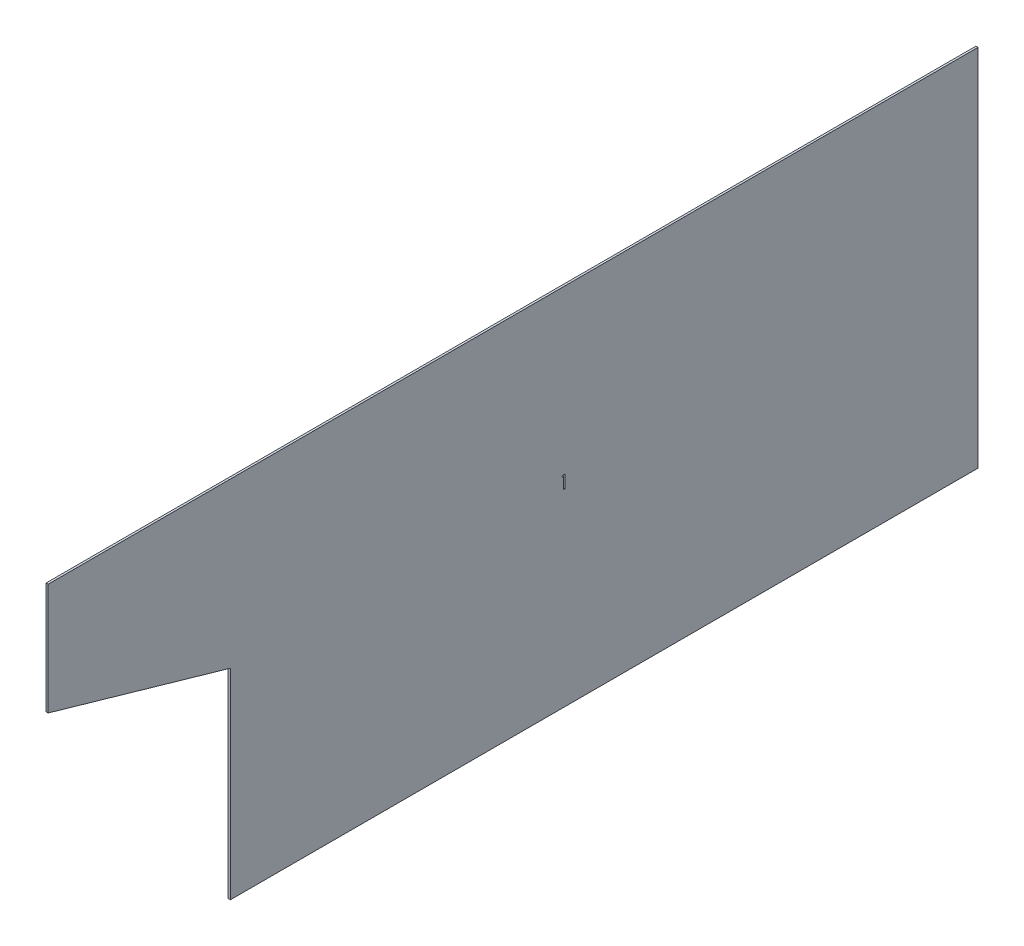
ISO-10303-21;
HEADER;
FILE_DESCRIPTION(('STEP AP214'),'2;1');
FILE_NAME('part.step','',(''),(''),'','','');
FILE_SCHEMA(('AUTOMOTIVE_DESIGN { 1 0 10303 214 1 1 1 1 }'));
ENDSEC;
DATA;
#1=APPLICATION_CONTEXT('core data for automotive mechanical design processes');
#2=APPLICATION_PROTOCOL_DEFINITION('international standard','automotive_design',2000,#1);
#3=PRODUCT_CONTEXT('',#1,'mechanical');
#4=PRODUCT('Part','Part','',(#3));
#5=PRODUCT_RELATED_PRODUCT_CATEGORY('part','',(#4));
#6=PRODUCT_DEFINITION_FORMATION('','',#4);
#7=PRODUCT_DEFINITION_CONTEXT('part definition',#1,'design');
#8=PRODUCT_DEFINITION('design','',#6,#7);
#9=PRODUCT_DEFINITION_SHAPE('','',#8);
#10=(LENGTH_UNIT() NAMED_UNIT(*) SI_UNIT(.MILLI.,.METRE.));
#11=(NAMED_UNIT(*) PLANE_ANGLE_UNIT() SI_UNIT($,.RADIAN.));
#12=(NAMED_UNIT(*) SI_UNIT($,.STERADIAN.) SOLID_ANGLE_UNIT());
#13=UNCERTAINTY_MEASURE_WITH_UNIT(LENGTH_MEASURE(1.E-05),#10,'distance_accuracy_value','');
#14=(GEOMETRIC_REPRESENTATION_CONTEXT(3) GLOBAL_UNCERTAINTY_ASSIGNED_CONTEXT((#13)) GLOBAL_UNIT_ASSIGNED_CONTEXT((#10,
#11,#12)) REPRESENTATION_CONTEXT('',''));
#15=CARTESIAN_POINT('',(0.,0.,0.));
#16=DIRECTION('',(0.,0.,1.));
#17=DIRECTION('',(1.,0.,0.));
#18=AXIS2_PLACEMENT_3D('',#15,#16,#17);
#19=CARTESIAN_POINT('',(48.35,103.982801655526,-78.1584620188543));
#20=DIRECTION('',(0.,0.,-1.));
#21=DIRECTION('',(0.,-1.,0.));
#22=AXIS2_PLACEMENT_3D('',#19,#20,#21);
#23=PLANE('',#22);
#24=DIRECTION('',(1.,0.,0.));
#25=VECTOR('',#24,1.);
#26=CARTESIAN_POINT('',(48.35,103.982801655526,-78.1584620188543));
#27=LINE('',#26,#25);
#28=CARTESIAN_POINT('',(45.175,103.982801655526,-78.1584620188544));
#29=VERTEX_POINT('',#28);
#30=CARTESIAN_POINT('',(48.35,103.982801655526,-78.1584620188543));
#31=VERTEX_POINT('',#30);
#32=EDGE_CURVE('E11',#29,#31,#27,.T.);
#33=ORIENTED_EDGE('',*,*,#32,.F.);
#34=DIRECTION('',(0.,-1.,0.));
#35=VECTOR('',#34,1.);
#36=CARTESIAN_POINT('',(45.175,350.,-78.1584620188544));
#37=LINE('',#36,#35);
#38=CARTESIAN_POINT('',(45.175,84.9328016555262,-78.1584620188544));
#39=VERTEX_POINT('',#38);
#40=EDGE_CURVE('E133',#29,#39,#37,.T.);
#41=ORIENTED_EDGE('',*,*,#40,.T.);
#42=DIRECTION('',(1.,0.,0.));
#43=VECTOR('',#42,1.);
#44=CARTESIAN_POINT('',(48.35,84.9328016555262,-78.1584620188543));
#45=LINE('',#44,#43);
#46=CARTESIAN_POINT('',(48.35,84.9328016555262,-78.1584620188543));
#47=VERTEX_POINT('',#46);
#48=EDGE_CURVE('E62',#39,#47,#45,.T.);
#49=ORIENTED_EDGE('',*,*,#48,.T.);
#50=DIRECTION('',(0.,-1.,0.));
#51=VECTOR('',#50,1.);
#52=CARTESIAN_POINT('',(48.35,103.982801655526,-78.1584620188543));
#53=LINE('',#52,#51);
#54=EDGE_CURVE('E200',#31,#47,#53,.T.);
#55=ORIENTED_EDGE('',*,*,#54,.F.);
#56=EDGE_LOOP('',(#33,#41,#49,#55));
#57=FACE_BOUND('',#56,.T.);
#58=ADVANCED_FACE('F51',(#57),#23,.F.);
#59=CARTESIAN_POINT('',(48.35,84.9328016555262,-78.1584620188543));
#60=DIRECTION('',(0.,-1.,0.));
#61=DIRECTION('',(0.,0.,1.));
#62=AXIS2_PLACEMENT_3D('',#59,#60,#61);
#63=PLANE('',#62);
#64=ORIENTED_EDGE('',*,*,#48,.F.);
#65=DIRECTION('',(0.,0.,1.));
#66=VECTOR('',#65,1.);
#67=CARTESIAN_POINT('',(45.175,84.9328016555262,701.675));
#68=LINE('',#67,#66);
#69=CARTESIAN_POINT('',(45.175,84.9328016555262,-76.4488466342389));
#70=VERTEX_POINT('',#69);
#71=EDGE_CURVE('E156',#39,#70,#68,.T.);
#72=ORIENTED_EDGE('',*,*,#71,.T.);
#73=DIRECTION('',(1.,0.,0.));
#74=VECTOR('',#73,1.);
#75=CARTESIAN_POINT('',(48.35,84.9328016555262,-76.4488466342389));
#76=LINE('',#75,#74);
#77=CARTESIAN_POINT('',(48.35,84.9328016555262,-76.4488466342389));
#78=VERTEX_POINT('',#77);
#79=EDGE_CURVE('E191',#70,#78,#76,.T.);
#80=ORIENTED_EDGE('',*,*,#79,.T.);
#81=DIRECTION('',(0.,0.,1.));
#82=VECTOR('',#81,1.);
#83=CARTESIAN_POINT('',(48.35,84.9328016555262,-78.1584620188543));
#84=LINE('',#83,#82);
#85=EDGE_CURVE('E208',#47,#78,#84,.T.);
#86=ORIENTED_EDGE('',*,*,#85,.F.);
#87=EDGE_LOOP('',(#64,#72,#80,#86));
#88=FACE_BOUND('',#87,.T.);
#89=ADVANCED_FACE('F212',(#88),#63,.F.);
#90=CARTESIAN_POINT('',(48.35,84.9328016555262,-76.4488466342389));
#91=DIRECTION('',(0.,0.,1.));
#92=DIRECTION('',(0.,1.,0.));
#93=AXIS2_PLACEMENT_3D('',#90,#91,#92);
#94=PLANE('',#93);
#95=ORIENTED_EDGE('',*,*,#79,.F.);
#96=DIRECTION('',(0.,-1.,0.));
#97=VECTOR('',#96,1.);
#98=CARTESIAN_POINT('',(45.175,350.,-76.4488466342389));
#99=LINE('',#98,#97);
#100=CARTESIAN_POINT('',(45.175,102.02895550168,-76.4488466342389));
#101=VERTEX_POINT('',#100);
#102=EDGE_CURVE('E152',#70,#101,#99,.F.);
#103=ORIENTED_EDGE('',*,*,#102,.T.);
#104=DIRECTION('',(1.,0.,0.));
#105=VECTOR('',#104,1.);
#106=CARTESIAN_POINT('',(48.35,102.02895550168,-76.4488466342389));
#107=LINE('',#106,#105);
#108=CARTESIAN_POINT('',(48.35,102.02895550168,-76.4488466342389));
#109=VERTEX_POINT('',#108);
#110=EDGE_CURVE('E188',#101,#109,#107,.T.);
#111=ORIENTED_EDGE('',*,*,#110,.T.);
#112=DIRECTION('',(0.,1.,0.));
#113=VECTOR('',#112,1.);
#114=CARTESIAN_POINT('',(48.35,84.9328016555262,-76.4488466342389));
#115=LINE('',#114,#113);
#116=EDGE_CURVE('E214',#78,#109,#115,.T.);
#117=ORIENTED_EDGE('',*,*,#116,.F.);
#118=EDGE_LOOP('',(#95,#103,#111,#117));
#119=FACE_BOUND('',#118,.T.);
#120=ADVANCED_FACE('F301',(#119),#94,.F.);
#121=CARTESIAN_POINT('',(48.35,102.02895550168,-76.4488466342389));
#122=DIRECTION('',(0.,-1.,0.));
#123=DIRECTION('',(0.,0.,1.));
#124=AXIS2_PLACEMENT_3D('',#121,#122,#123);
#125=PLANE('',#124);
#126=ORIENTED_EDGE('',*,*,#110,.F.);
#127=DIRECTION('',(0.,0.,1.));
#128=VECTOR('',#127,1.);
#129=CARTESIAN_POINT('',(45.175,102.02895550168,701.675));
#130=LINE('',#129,#128);
#131=CARTESIAN_POINT('',(45.175,102.02895550168,-73.5180774034697));
#132=VERTEX_POINT('',#131);
#133=EDGE_CURVE('E148',#101,#132,#130,.T.);
#134=ORIENTED_EDGE('',*,*,#133,.T.);
#135=DIRECTION('',(1.,0.,0.));
#136=VECTOR('',#135,1.);
#137=CARTESIAN_POINT('',(48.35,102.02895550168,-73.5180774034697));
#138=LINE('',#137,#136);
#139=CARTESIAN_POINT('',(48.35,102.02895550168,-73.5180774034697));
#140=VERTEX_POINT('',#139);
#141=EDGE_CURVE('E70',#132,#140,#138,.T.);
#142=ORIENTED_EDGE('',*,*,#141,.T.);
#143=DIRECTION('',(0.,0.,1.));
#144=VECTOR('',#143,1.);
#145=CARTESIAN_POINT('',(48.35,102.02895550168,-76.4488466342389));
#146=LINE('',#145,#144);
#147=EDGE_CURVE('E185',#109,#140,#146,.T.);
#148=ORIENTED_EDGE('',*,*,#147,.F.);
#149=EDGE_LOOP('',(#126,#134,#142,#148));
#150=FACE_BOUND('',#149,.T.);
#151=ADVANCED_FACE('F298',(#150),#125,.F.);
#152=CARTESIAN_POINT('',(48.35,102.02895550168,-73.5180774034697));
#153=DIRECTION('',(0.,0.496686511837687,0.867930013859707));
#154=DIRECTION('',(0.,0.867930013859707,-0.496686511837687));
#155=AXIS2_PLACEMENT_3D('',#152,#153,#154);
#156=PLANE('',#155);
#157=ORIENTED_EDGE('',*,*,#141,.F.);
#158=DIRECTION('',(0.,0.867930013859707,-0.496686511837687));
#159=VECTOR('',#158,1.);
#160=CARTESIAN_POINT('',(45.175,102.02895550168,-73.5180774034697));
#161=LINE('',#160,#159);
#162=CARTESIAN_POINT('',(45.175,103.982801655526,-74.6361963938543));
#163=VERTEX_POINT('',#162);
#164=EDGE_CURVE('E131',#132,#163,#161,.T.);
#165=ORIENTED_EDGE('',*,*,#164,.T.);
#166=DIRECTION('',(1.,0.,0.));
#167=VECTOR('',#166,1.);
#168=CARTESIAN_POINT('',(48.35,103.982801655526,-74.6361963938543));
#169=LINE('',#168,#167);
#170=CARTESIAN_POINT('',(48.35,103.982801655526,-74.6361963938543));
#171=VERTEX_POINT('',#170);
#172=EDGE_CURVE('E55',#163,#171,#169,.T.);
#173=ORIENTED_EDGE('',*,*,#172,.T.);
#174=DIRECTION('',(0.,0.867930013859707,-0.496686511837687));
#175=VECTOR('',#174,1.);
#176=CARTESIAN_POINT('',(48.35,102.02895550168,-73.5180774034697));
#177=LINE('',#176,#175);
#178=EDGE_CURVE('E295',#140,#171,#177,.T.);
#179=ORIENTED_EDGE('',*,*,#178,.F.);
#180=EDGE_LOOP('',(#157,#165,#173,#179));
#181=FACE_BOUND('',#180,.T.);
#182=ADVANCED_FACE('F136',(#181),#156,.F.);
#183=CARTESIAN_POINT('',(48.35,-200.,701.675));
#184=DIRECTION('',(0.,1.,0.));
#185=DIRECTION('',(0.,0.,-1.));
#186=AXIS2_PLACEMENT_3D('',#183,#184,#185);
#187=PLANE('',#186);
#188=DIRECTION('',(1.,0.,0.));
#189=VECTOR('',#188,1.);
#190=CARTESIAN_POINT('',(48.35,-200.,426.675));
#191=LINE('',#190,#189);
#192=CARTESIAN_POINT('',(45.175,-200.,426.675));
#193=VERTEX_POINT('',#192);
#194=CARTESIAN_POINT('',(48.35,-200.,426.675));
#195=VERTEX_POINT('',#194);
#196=EDGE_CURVE('E126',#193,#195,#191,.T.);
#197=ORIENTED_EDGE('',*,*,#196,.F.);
#198=DIRECTION('',(0.,0.,1.));
#199=VECTOR('',#198,1.);
#200=CARTESIAN_POINT('',(45.175,-200.,701.675));
#201=LINE('',#200,#199);
#202=CARTESIAN_POINT('',(45.175,-200.,-701.675));
#203=VERTEX_POINT('',#202);
#204=EDGE_CURVE('E233',#193,#203,#201,.F.);
#205=ORIENTED_EDGE('',*,*,#204,.T.);
#206=DIRECTION('',(1.,0.,0.));
#207=VECTOR('',#206,1.);
#208=CARTESIAN_POINT('',(48.35,-200.,-701.675));
#209=LINE('',#208,#207);
#210=CARTESIAN_POINT('',(48.35,-200.,-701.675));
#211=VERTEX_POINT('',#210);
#212=EDGE_CURVE('E175',#203,#211,#209,.T.);
#213=ORIENTED_EDGE('',*,*,#212,.T.);
#214=DIRECTION('',(0.,0.,-1.));
#215=VECTOR('',#214,1.);
#216=CARTESIAN_POINT('',(48.35,-200.,701.675));
#217=LINE('',#216,#215);
#218=EDGE_CURVE('E274',#195,#211,#217,.T.);
#219=ORIENTED_EDGE('',*,*,#218,.F.);
#220=EDGE_LOOP('',(#197,#205,#213,#219));
#221=FACE_BOUND('',#220,.T.);
#222=ADVANCED_FACE('F273',(#221),#187,.F.);
#223=CARTESIAN_POINT('',(48.35,350.,-701.675));
#224=DIRECTION('',(0.,0.,1.));
#225=DIRECTION('',(0.,1.,0.));
#226=AXIS2_PLACEMENT_3D('',#223,#224,#225);
#227=PLANE('',#226);
#228=ORIENTED_EDGE('',*,*,#212,.F.);
#229=DIRECTION('',(0.,-1.,0.));
#230=VECTOR('',#229,1.);
#231=CARTESIAN_POINT('',(45.175,350.,-701.675));
#232=LINE('',#231,#230);
#233=CARTESIAN_POINT('',(45.175,350.,-701.675));
#234=VERTEX_POINT('',#233);
#235=EDGE_CURVE('E230',#203,#234,#232,.F.);
#236=ORIENTED_EDGE('',*,*,#235,.T.);
#237=DIRECTION('',(1.,0.,0.));
#238=VECTOR('',#237,1.);
#239=CARTESIAN_POINT('',(48.35,350.,-701.675));
#240=LINE('',#239,#238);
#241=CARTESIAN_POINT('',(48.35,350.,-701.675));
#242=VERTEX_POINT('',#241);
#243=EDGE_CURVE('E171',#234,#242,#240,.T.);
#244=ORIENTED_EDGE('',*,*,#243,.T.);
#245=DIRECTION('',(0.,1.,0.));
#246=VECTOR('',#245,1.);
#247=CARTESIAN_POINT('',(48.35,350.,-701.675));
#248=LINE('',#247,#246);
#249=EDGE_CURVE('E280',#211,#242,#248,.T.);
#250=ORIENTED_EDGE('',*,*,#249,.F.);
#251=EDGE_LOOP('',(#228,#236,#244,#250));
#252=FACE_BOUND('',#251,.T.);
#253=ADVANCED_FACE('F285',(#252),#227,.F.);
#254=CARTESIAN_POINT('',(48.35,350.,701.675));
#255=DIRECTION('',(0.,1.,0.));
#256=DIRECTION('',(0.,0.,-1.));
#257=AXIS2_PLACEMENT_3D('',#254,#255,#256);
#258=PLANE('',#257);
#259=ORIENTED_EDGE('',*,*,#243,.F.);
#260=DIRECTION('',(0.,0.,1.));
#261=VECTOR('',#260,1.);
#262=CARTESIAN_POINT('',(45.175,350.,701.675));
#263=LINE('',#262,#261);
#264=CARTESIAN_POINT('',(45.175,350.,701.675));
#265=VERTEX_POINT('',#264);
#266=EDGE_CURVE('E142',#265,#234,#263,.F.);
#267=ORIENTED_EDGE('',*,*,#266,.F.);
#268=DIRECTION('',(1.,0.,0.));
#269=VECTOR('',#268,1.);
#270=CARTESIAN_POINT('',(48.35,350.,701.675));
#271=LINE('',#270,#269);
#272=CARTESIAN_POINT('',(48.35,350.,701.675));
#273=VERTEX_POINT('',#272);
#274=EDGE_CURVE('E166',#265,#273,#271,.T.);
#275=ORIENTED_EDGE('',*,*,#274,.T.);
#276=DIRECTION('',(0.,0.,-1.));
#277=VECTOR('',#276,1.);
#278=CARTESIAN_POINT('',(48.35,350.,701.675));
#279=LINE('',#278,#277);
#280=EDGE_CURVE('E287',#273,#242,#279,.T.);
#281=ORIENTED_EDGE('',*,*,#280,.T.);
#282=EDGE_LOOP('',(#259,#267,#275,#281));
#283=FACE_BOUND('',#282,.T.);
#284=ADVANCED_FACE('F357',(#283),#258,.T.);
#285=CARTESIAN_POINT('',(48.35,350.,701.675));
#286=DIRECTION('',(0.,0.,1.));
#287=DIRECTION('',(0.,1.,0.));
#288=AXIS2_PLACEMENT_3D('',#285,#286,#287);
#289=PLANE('',#288);
#290=ORIENTED_EDGE('',*,*,#274,.F.);
#291=DIRECTION('',(0.,-1.,0.));
#292=VECTOR('',#291,1.);
#293=CARTESIAN_POINT('',(45.175,350.,701.675));
#294=LINE('',#293,#292);
#295=CARTESIAN_POINT('',(45.175,181.7,701.675));
#296=VERTEX_POINT('',#295);
#297=EDGE_CURVE('E138',#296,#265,#294,.F.);
#298=ORIENTED_EDGE('',*,*,#297,.F.);
#299=DIRECTION('',(1.,0.,0.));
#300=VECTOR('',#299,1.);
#301=CARTESIAN_POINT('',(48.35,181.7,701.675));
#302=LINE('',#301,#300);
#303=CARTESIAN_POINT('',(48.35,181.7,701.675));
#304=VERTEX_POINT('',#303);
#305=EDGE_CURVE('E162',#296,#304,#302,.T.);
#306=ORIENTED_EDGE('',*,*,#305,.T.);
#307=DIRECTION('',(0.,1.,0.));
#308=VECTOR('',#307,1.);
#309=CARTESIAN_POINT('',(48.35,350.,701.675));
#310=LINE('',#309,#308);
#311=EDGE_CURVE('E260',#304,#273,#310,.T.);
#312=ORIENTED_EDGE('',*,*,#311,.T.);
#313=EDGE_LOOP('',(#290,#298,#306,#312));
#314=FACE_BOUND('',#313,.T.);
#315=ADVANCED_FACE('F258',(#314),#289,.T.);
#316=CARTESIAN_POINT('',(48.35,-18.3571552903526,5.27351006522855));
#317=DIRECTION('',(0.,0.961127289095562,-0.276105657594725));
#318=DIRECTION('',(0.,-0.276105657594725,-0.961127289095562));
#319=AXIS2_PLACEMENT_3D('',#316,#317,#318);
#320=PLANE('',#319);
#321=ORIENTED_EDGE('',*,*,#305,.F.);
#322=DIRECTION('',(0.,-0.276105657594725,-0.961127289095562));
#323=VECTOR('',#322,1.);
#324=CARTESIAN_POINT('',(45.175,-18.3571552903526,5.27351006522855));
#325=LINE('',#324,#323);
#326=CARTESIAN_POINT('',(45.175,102.7,426.675));
#327=VERTEX_POINT('',#326);
#328=EDGE_CURVE('E223',#296,#327,#325,.T.);
#329=ORIENTED_EDGE('',*,*,#328,.T.);
#330=DIRECTION('',(1.,0.,0.));
#331=VECTOR('',#330,1.);
#332=CARTESIAN_POINT('',(48.35,102.7,426.675));
#333=LINE('',#332,#331);
#334=CARTESIAN_POINT('',(48.35,102.7,426.675));
#335=VERTEX_POINT('',#334);
#336=EDGE_CURVE('E167',#327,#335,#333,.T.);
#337=ORIENTED_EDGE('',*,*,#336,.T.);
#338=DIRECTION('',(0.,-0.276105657594725,-0.961127289095562));
#339=VECTOR('',#338,1.);
#340=CARTESIAN_POINT('',(48.35,-18.3571552903526,5.27351006522855));
#341=LINE('',#340,#339);
#342=EDGE_CURVE('E151',#304,#335,#341,.T.);
#343=ORIENTED_EDGE('',*,*,#342,.F.);
#344=EDGE_LOOP('',(#321,#329,#337,#343));
#345=FACE_BOUND('',#344,.T.);
#346=ADVANCED_FACE('F251',(#345),#320,.F.);
#347=CARTESIAN_POINT('',(48.35,350.,426.675));
#348=DIRECTION('',(0.,0.,-1.));
#349=DIRECTION('',(0.,-1.,0.));
#350=AXIS2_PLACEMENT_3D('',#347,#348,#349);
#351=PLANE('',#350);
#352=DIRECTION('',(0.,-1.,0.));
#353=VECTOR('',#352,1.);
#354=CARTESIAN_POINT('',(45.175,350.,426.675));
#355=LINE('',#354,#353);
#356=EDGE_CURVE('E146',#327,#193,#355,.T.);
#357=ORIENTED_EDGE('',*,*,#356,.T.);
#358=ORIENTED_EDGE('',*,*,#196,.T.);
#359=DIRECTION('',(0.,-1.,0.));
#360=VECTOR('',#359,1.);
#361=CARTESIAN_POINT('',(48.35,350.,426.675));
#362=LINE('',#361,#360);
#363=EDGE_CURVE('E282',#335,#195,#362,.T.);
#364=ORIENTED_EDGE('',*,*,#363,.F.);
#365=ORIENTED_EDGE('',*,*,#336,.F.);
#366=EDGE_LOOP('',(#357,#358,#364,#365));
#367=FACE_BOUND('',#366,.T.);
#368=ADVANCED_FACE('F242',(#367),#351,.F.);
#369=CARTESIAN_POINT('',(48.35,103.982801655526,-74.6361963938543));
#370=DIRECTION('',(0.,1.,0.));
#371=DIRECTION('',(0.,0.,-1.));
#372=AXIS2_PLACEMENT_3D('',#369,#370,#371);
#373=PLANE('',#372);
#374=DIRECTION('',(0.,0.,1.));
#375=VECTOR('',#374,1.);
#376=CARTESIAN_POINT('',(45.175,103.982801655526,701.675));
#377=LINE('',#376,#375);
#378=EDGE_CURVE('E118',#163,#29,#377,.F.);
#379=ORIENTED_EDGE('',*,*,#378,.T.);
#380=ORIENTED_EDGE('',*,*,#32,.T.);
#381=DIRECTION('',(0.,0.,-1.));
#382=VECTOR('',#381,1.);
#383=CARTESIAN_POINT('',(48.35,103.982801655526,-74.6361963938543));
#384=LINE('',#383,#382);
#385=EDGE_CURVE('E121',#171,#31,#384,.T.);
#386=ORIENTED_EDGE('',*,*,#385,.F.);
#387=ORIENTED_EDGE('',*,*,#172,.F.);
#388=EDGE_LOOP('',(#379,#380,#386,#387));
#389=FACE_BOUND('',#388,.T.);
#390=ADVANCED_FACE('F53',(#389),#373,.F.);
#391=CARTESIAN_POINT('',(48.35,350.,701.675));
#392=DIRECTION('',(-1.,0.,0.));
#393=DIRECTION('',(0.,-1.,0.));
#394=AXIS2_PLACEMENT_3D('',#391,#392,#393);
#395=PLANE('',#394);
#396=ORIENTED_EDGE('',*,*,#342,.T.);
#397=ORIENTED_EDGE('',*,*,#363,.T.);
#398=ORIENTED_EDGE('',*,*,#218,.T.);
#399=ORIENTED_EDGE('',*,*,#249,.T.);
#400=ORIENTED_EDGE('',*,*,#280,.F.);
#401=ORIENTED_EDGE('',*,*,#311,.F.);
#402=EDGE_LOOP('',(#396,#397,#398,#399,#400,#401));
#403=FACE_BOUND('',#402,.T.);
#404=ORIENTED_EDGE('',*,*,#178,.T.);
#405=ORIENTED_EDGE('',*,*,#385,.T.);
#406=ORIENTED_EDGE('',*,*,#54,.T.);
#407=ORIENTED_EDGE('',*,*,#85,.T.);
#408=ORIENTED_EDGE('',*,*,#116,.T.);
#409=ORIENTED_EDGE('',*,*,#147,.T.);
#410=EDGE_LOOP('',(#404,#405,#406,#407,#408,#409));
#411=FACE_BOUND('',#410,.T.);
#412=ADVANCED_FACE('F206',(#403,#411),#395,.F.);
#413=CARTESIAN_POINT('',(45.175,350.,701.675));
#414=DIRECTION('',(-1.,0.,0.));
#415=DIRECTION('',(0.,-1.,0.));
#416=AXIS2_PLACEMENT_3D('',#413,#414,#415);
#417=PLANE('',#416);
#418=ORIENTED_EDGE('',*,*,#328,.F.);
#419=ORIENTED_EDGE('',*,*,#297,.T.);
#420=ORIENTED_EDGE('',*,*,#266,.T.);
#421=ORIENTED_EDGE('',*,*,#235,.F.);
#422=ORIENTED_EDGE('',*,*,#204,.F.);
#423=ORIENTED_EDGE('',*,*,#356,.F.);
#424=EDGE_LOOP('',(#418,#419,#420,#421,#422,#423));
#425=FACE_BOUND('',#424,.T.);
#426=ORIENTED_EDGE('',*,*,#164,.F.);
#427=ORIENTED_EDGE('',*,*,#133,.F.);
#428=ORIENTED_EDGE('',*,*,#102,.F.);
#429=ORIENTED_EDGE('',*,*,#71,.F.);
#430=ORIENTED_EDGE('',*,*,#40,.F.);
#431=ORIENTED_EDGE('',*,*,#378,.F.);
#432=EDGE_LOOP('',(#426,#427,#428,#429,#430,#431));
#433=FACE_BOUND('',#432,.T.);
#434=ADVANCED_FACE('F129',(#425,#433),#417,.T.);
#435=CLOSED_SHELL('',(#58,#89,#120,#151,#182,#222,#253,#284,#315,#346,#368,#390,#412,#434));
#436=MANIFOLD_SOLID_BREP('B2',#435);
#437=ADVANCED_BREP_SHAPE_REPRESENTATION('',(#18,#436),#14);
#438=SHAPE_DEFINITION_REPRESENTATION(#9,#437);
ENDSEC;
END-ISO-10303-21;
